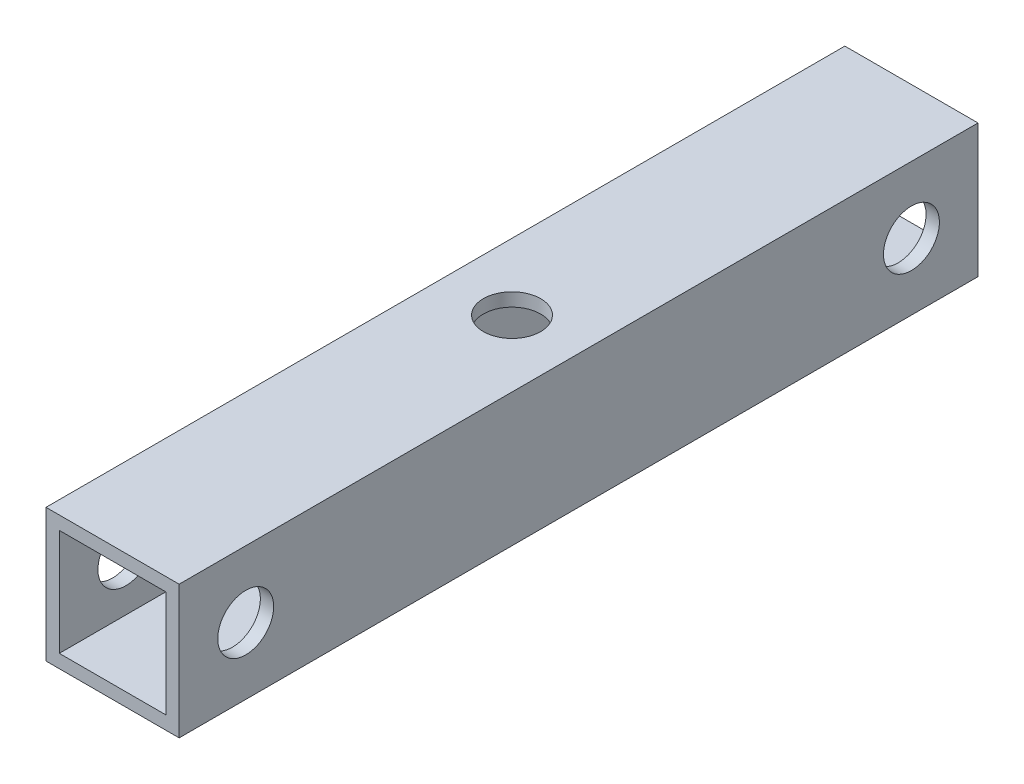
ISO-10303-21;
HEADER;
FILE_DESCRIPTION(('STEP AP214'),'2;1');
FILE_NAME('part.step','',(''),(''),'','','');
FILE_SCHEMA(('AUTOMOTIVE_DESIGN { 1 0 10303 214 1 1 1 1 }'));
ENDSEC;
DATA;
#1=APPLICATION_CONTEXT('core data for automotive mechanical design processes');
#2=APPLICATION_PROTOCOL_DEFINITION('international standard','automotive_design',2000,#1);
#3=PRODUCT_CONTEXT('',#1,'mechanical');
#4=PRODUCT('Part','Part','',(#3));
#5=PRODUCT_RELATED_PRODUCT_CATEGORY('part','',(#4));
#6=PRODUCT_DEFINITION_FORMATION('','',#4);
#7=PRODUCT_DEFINITION_CONTEXT('part definition',#1,'design');
#8=PRODUCT_DEFINITION('design','',#6,#7);
#9=PRODUCT_DEFINITION_SHAPE('','',#8);
#10=(LENGTH_UNIT() NAMED_UNIT(*) SI_UNIT(.MILLI.,.METRE.));
#11=(NAMED_UNIT(*) PLANE_ANGLE_UNIT() SI_UNIT($,.RADIAN.));
#12=(NAMED_UNIT(*) SI_UNIT($,.STERADIAN.) SOLID_ANGLE_UNIT());
#13=UNCERTAINTY_MEASURE_WITH_UNIT(LENGTH_MEASURE(1.E-05),#10,'distance_accuracy_value','');
#14=(GEOMETRIC_REPRESENTATION_CONTEXT(3) GLOBAL_UNCERTAINTY_ASSIGNED_CONTEXT((#13)) GLOBAL_UNIT_ASSIGNED_CONTEXT((#10,
#11,#12)) REPRESENTATION_CONTEXT('',''));
#15=CARTESIAN_POINT('',(0.,0.,0.));
#16=DIRECTION('',(0.,0.,1.));
#17=DIRECTION('',(1.,0.,0.));
#18=AXIS2_PLACEMENT_3D('',#15,#16,#17);
#19=CARTESIAN_POINT('',(0.,0.,60.));
#20=DIRECTION('',(0.,0.,1.));
#21=DIRECTION('',(1.,0.,0.));
#22=AXIS2_PLACEMENT_3D('',#19,#20,#21);
#23=PLANE('',#22);
#24=DIRECTION('',(0.,-1.,0.));
#25=VECTOR('',#24,1.);
#26=CARTESIAN_POINT('',(0.,0.,60.));
#27=LINE('',#26,#25);
#28=CARTESIAN_POINT('',(0.,10.,60.));
#29=VERTEX_POINT('',#28);
#30=CARTESIAN_POINT('',(0.,0.,60.));
#31=VERTEX_POINT('',#30);
#32=EDGE_CURVE('E164',#29,#31,#27,.T.);
#33=ORIENTED_EDGE('',*,*,#32,.T.);
#34=DIRECTION('',(1.,0.,0.));
#35=VECTOR('',#34,1.);
#36=CARTESIAN_POINT('',(0.,0.,60.));
#37=LINE('',#36,#35);
#38=CARTESIAN_POINT('',(10.,0.,60.));
#39=VERTEX_POINT('',#38);
#40=EDGE_CURVE('E167',#31,#39,#37,.T.);
#41=ORIENTED_EDGE('',*,*,#40,.T.);
#42=DIRECTION('',(0.,1.,0.));
#43=VECTOR('',#42,1.);
#44=CARTESIAN_POINT('',(10.,0.,60.));
#45=LINE('',#44,#43);
#46=CARTESIAN_POINT('',(9.99999999999999,10.,60.));
#47=VERTEX_POINT('',#46);
#48=EDGE_CURVE('E170',#39,#47,#45,.T.);
#49=ORIENTED_EDGE('',*,*,#48,.T.);
#50=DIRECTION('',(-1.,0.,0.));
#51=VECTOR('',#50,1.);
#52=CARTESIAN_POINT('',(0.,10.,60.));
#53=LINE('',#52,#51);
#54=EDGE_CURVE('E172',#47,#29,#53,.T.);
#55=ORIENTED_EDGE('',*,*,#54,.T.);
#56=EDGE_LOOP('',(#33,#41,#49,#55));
#57=FACE_BOUND('',#56,.T.);
#58=DIRECTION('',(1.,0.,0.));
#59=VECTOR('',#58,1.);
#60=CARTESIAN_POINT('',(0.,1.,60.));
#61=LINE('',#60,#59);
#62=CARTESIAN_POINT('',(1.,1.,60.));
#63=VERTEX_POINT('',#62);
#64=CARTESIAN_POINT('',(9.,1.,60.));
#65=VERTEX_POINT('',#64);
#66=EDGE_CURVE('E134',#63,#65,#61,.T.);
#67=ORIENTED_EDGE('',*,*,#66,.F.);
#68=DIRECTION('',(0.,-1.,0.));
#69=VECTOR('',#68,1.);
#70=CARTESIAN_POINT('',(1.,0.,60.));
#71=LINE('',#70,#69);
#72=CARTESIAN_POINT('',(0.999999999999997,9.,60.));
#73=VERTEX_POINT('',#72);
#74=EDGE_CURVE('E126',#73,#63,#71,.T.);
#75=ORIENTED_EDGE('',*,*,#74,.F.);
#76=DIRECTION('',(-1.,0.,0.));
#77=VECTOR('',#76,1.);
#78=CARTESIAN_POINT('',(0.,9.,60.));
#79=LINE('',#78,#77);
#80=CARTESIAN_POINT('',(8.99999999999999,9.,60.));
#81=VERTEX_POINT('',#80);
#82=EDGE_CURVE('E148',#81,#73,#79,.T.);
#83=ORIENTED_EDGE('',*,*,#82,.F.);
#84=DIRECTION('',(0.,1.,0.));
#85=VECTOR('',#84,1.);
#86=CARTESIAN_POINT('',(9.,0.,60.));
#87=LINE('',#86,#85);
#88=EDGE_CURVE('E146',#65,#81,#87,.T.);
#89=ORIENTED_EDGE('',*,*,#88,.F.);
#90=EDGE_LOOP('',(#67,#75,#83,#89));
#91=FACE_BOUND('',#90,.T.);
#92=ADVANCED_FACE('F59',(#57,#91),#23,.T.);
#93=CARTESIAN_POINT('',(0.,0.,0.));
#94=DIRECTION('',(0.,0.,1.));
#95=DIRECTION('',(1.,0.,0.));
#96=AXIS2_PLACEMENT_3D('',#93,#94,#95);
#97=PLANE('',#96);
#98=DIRECTION('',(0.,-1.,0.));
#99=VECTOR('',#98,1.);
#100=CARTESIAN_POINT('',(0.,0.,0.));
#101=LINE('',#100,#99);
#102=CARTESIAN_POINT('',(0.,10.,0.));
#103=VERTEX_POINT('',#102);
#104=CARTESIAN_POINT('',(0.,0.,0.));
#105=VERTEX_POINT('',#104);
#106=EDGE_CURVE('E142',#103,#105,#101,.T.);
#107=ORIENTED_EDGE('',*,*,#106,.F.);
#108=DIRECTION('',(-1.,0.,0.));
#109=VECTOR('',#108,1.);
#110=CARTESIAN_POINT('',(0.,10.,0.));
#111=LINE('',#110,#109);
#112=CARTESIAN_POINT('',(9.99999999999999,10.,0.));
#113=VERTEX_POINT('',#112);
#114=EDGE_CURVE('E168',#113,#103,#111,.T.);
#115=ORIENTED_EDGE('',*,*,#114,.F.);
#116=DIRECTION('',(0.,1.,0.));
#117=VECTOR('',#116,1.);
#118=CARTESIAN_POINT('',(10.,0.,0.));
#119=LINE('',#118,#117);
#120=CARTESIAN_POINT('',(10.,0.,0.));
#121=VERTEX_POINT('',#120);
#122=EDGE_CURVE('E179',#121,#113,#119,.T.);
#123=ORIENTED_EDGE('',*,*,#122,.F.);
#124=DIRECTION('',(1.,0.,0.));
#125=VECTOR('',#124,1.);
#126=CARTESIAN_POINT('',(0.,0.,0.));
#127=LINE('',#126,#125);
#128=EDGE_CURVE('E177',#105,#121,#127,.T.);
#129=ORIENTED_EDGE('',*,*,#128,.F.);
#130=EDGE_LOOP('',(#107,#115,#123,#129));
#131=FACE_BOUND('',#130,.T.);
#132=DIRECTION('',(0.,-1.,0.));
#133=VECTOR('',#132,1.);
#134=CARTESIAN_POINT('',(1.,0.,0.));
#135=LINE('',#134,#133);
#136=CARTESIAN_POINT('',(0.999999999999997,9.,0.));
#137=VERTEX_POINT('',#136);
#138=CARTESIAN_POINT('',(1.,1.,0.));
#139=VERTEX_POINT('',#138);
#140=EDGE_CURVE('E84',#137,#139,#135,.T.);
#141=ORIENTED_EDGE('',*,*,#140,.T.);
#142=DIRECTION('',(1.,0.,0.));
#143=VECTOR('',#142,1.);
#144=CARTESIAN_POINT('',(0.,1.,0.));
#145=LINE('',#144,#143);
#146=CARTESIAN_POINT('',(9.,1.,0.));
#147=VERTEX_POINT('',#146);
#148=EDGE_CURVE('E141',#139,#147,#145,.T.);
#149=ORIENTED_EDGE('',*,*,#148,.T.);
#150=DIRECTION('',(0.,1.,0.));
#151=VECTOR('',#150,1.);
#152=CARTESIAN_POINT('',(9.,0.,0.));
#153=LINE('',#152,#151);
#154=CARTESIAN_POINT('',(8.99999999999999,9.,0.));
#155=VERTEX_POINT('',#154);
#156=EDGE_CURVE('E156',#147,#155,#153,.T.);
#157=ORIENTED_EDGE('',*,*,#156,.T.);
#158=DIRECTION('',(-1.,0.,0.));
#159=VECTOR('',#158,1.);
#160=CARTESIAN_POINT('',(0.,9.,0.));
#161=LINE('',#160,#159);
#162=EDGE_CURVE('E135',#155,#137,#161,.T.);
#163=ORIENTED_EDGE('',*,*,#162,.T.);
#164=EDGE_LOOP('',(#141,#149,#157,#163));
#165=FACE_BOUND('',#164,.T.);
#166=ADVANCED_FACE('F241',(#131,#165),#97,.F.);
#167=CARTESIAN_POINT('',(0.,0.,60.));
#168=DIRECTION('',(1.,0.,0.));
#169=DIRECTION('',(0.,1.,0.));
#170=AXIS2_PLACEMENT_3D('',#167,#168,#169);
#171=PLANE('',#170);
#172=CARTESIAN_POINT('',(0.,5.,55.));
#173=DIRECTION('',(1.,0.,0.));
#174=DIRECTION('',(0.,1.,0.));
#175=AXIS2_PLACEMENT_3D('',#172,#173,#174);
#176=CIRCLE('',#175,2.1);
#177=CARTESIAN_POINT('',(0.,7.09999999999999,55.));
#178=VERTEX_POINT('',#177);
#179=EDGE_CURVE('E192',#178,#178,#176,.F.);
#180=ORIENTED_EDGE('',*,*,#179,.F.);
#181=EDGE_LOOP('',(#180));
#182=FACE_BOUND('',#181,.T.);
#183=CARTESIAN_POINT('',(0.,5.,5.));
#184=DIRECTION('',(1.,0.,0.));
#185=DIRECTION('',(0.,1.,0.));
#186=AXIS2_PLACEMENT_3D('',#183,#184,#185);
#187=CIRCLE('',#186,2.1);
#188=CARTESIAN_POINT('',(0.,7.09999999999999,5.));
#189=VERTEX_POINT('',#188);
#190=EDGE_CURVE('E203',#189,#189,#187,.F.);
#191=ORIENTED_EDGE('',*,*,#190,.F.);
#192=EDGE_LOOP('',(#191));
#193=FACE_BOUND('',#192,.T.);
#194=ORIENTED_EDGE('',*,*,#106,.T.);
#195=DIRECTION('',(0.,0.,-1.));
#196=VECTOR('',#195,1.);
#197=CARTESIAN_POINT('',(0.,0.,60.));
#198=LINE('',#197,#196);
#199=EDGE_CURVE('E12',#31,#105,#198,.T.);
#200=ORIENTED_EDGE('',*,*,#199,.F.);
#201=ORIENTED_EDGE('',*,*,#32,.F.);
#202=DIRECTION('',(0.,0.,-1.));
#203=VECTOR('',#202,1.);
#204=CARTESIAN_POINT('',(0.,10.,60.));
#205=LINE('',#204,#203);
#206=EDGE_CURVE('E174',#29,#103,#205,.T.);
#207=ORIENTED_EDGE('',*,*,#206,.T.);
#208=EDGE_LOOP('',(#194,#200,#201,#207));
#209=FACE_BOUND('',#208,.T.);
#210=ADVANCED_FACE('F61',(#182,#193,#209),#171,.F.);
#211=CARTESIAN_POINT('',(0.,0.,60.));
#212=DIRECTION('',(0.,1.,0.));
#213=DIRECTION('',(0.,0.,1.));
#214=AXIS2_PLACEMENT_3D('',#211,#212,#213);
#215=PLANE('',#214);
#216=CARTESIAN_POINT('',(5.,0.,30.));
#217=DIRECTION('',(0.,1.,0.));
#218=DIRECTION('',(0.,0.,1.));
#219=AXIS2_PLACEMENT_3D('',#216,#217,#218);
#220=CIRCLE('',#219,2.15);
#221=CARTESIAN_POINT('',(5.,0.,32.15));
#222=VERTEX_POINT('',#221);
#223=EDGE_CURVE('E217',#222,#222,#220,.F.);
#224=ORIENTED_EDGE('',*,*,#223,.F.);
#225=EDGE_LOOP('',(#224));
#226=FACE_BOUND('',#225,.T.);
#227=ORIENTED_EDGE('',*,*,#128,.T.);
#228=DIRECTION('',(0.,0.,-1.));
#229=VECTOR('',#228,1.);
#230=CARTESIAN_POINT('',(10.,0.,60.));
#231=LINE('',#230,#229);
#232=EDGE_CURVE('E68',#39,#121,#231,.T.);
#233=ORIENTED_EDGE('',*,*,#232,.F.);
#234=ORIENTED_EDGE('',*,*,#40,.F.);
#235=ORIENTED_EDGE('',*,*,#199,.T.);
#236=EDGE_LOOP('',(#227,#233,#234,#235));
#237=FACE_BOUND('',#236,.T.);
#238=ADVANCED_FACE('F245',(#226,#237),#215,.F.);
#239=CARTESIAN_POINT('',(10.,0.,60.));
#240=DIRECTION('',(-1.,0.,0.));
#241=DIRECTION('',(0.,-1.,0.));
#242=AXIS2_PLACEMENT_3D('',#239,#240,#241);
#243=PLANE('',#242);
#244=CARTESIAN_POINT('',(10.,5.,55.));
#245=DIRECTION('',(1.,0.,0.));
#246=DIRECTION('',(0.,1.,0.));
#247=AXIS2_PLACEMENT_3D('',#244,#245,#246);
#248=CIRCLE('',#247,2.1);
#249=CARTESIAN_POINT('',(10.,7.1,55.));
#250=VERTEX_POINT('',#249);
#251=EDGE_CURVE('E206',#250,#250,#248,.T.);
#252=ORIENTED_EDGE('',*,*,#251,.F.);
#253=EDGE_LOOP('',(#252));
#254=FACE_BOUND('',#253,.T.);
#255=CARTESIAN_POINT('',(10.,5.,5.));
#256=DIRECTION('',(1.,0.,0.));
#257=DIRECTION('',(0.,-1.,0.));
#258=AXIS2_PLACEMENT_3D('',#255,#256,#257);
#259=CIRCLE('',#258,2.1);
#260=CARTESIAN_POINT('',(10.,2.9,5.));
#261=VERTEX_POINT('',#260);
#262=EDGE_CURVE('E207',#261,#261,#259,.T.);
#263=ORIENTED_EDGE('',*,*,#262,.F.);
#264=EDGE_LOOP('',(#263));
#265=FACE_BOUND('',#264,.T.);
#266=ORIENTED_EDGE('',*,*,#122,.T.);
#267=DIRECTION('',(0.,0.,-1.));
#268=VECTOR('',#267,1.);
#269=CARTESIAN_POINT('',(9.99999999999999,10.,60.));
#270=LINE('',#269,#268);
#271=EDGE_CURVE('E184',#47,#113,#270,.T.);
#272=ORIENTED_EDGE('',*,*,#271,.F.);
#273=ORIENTED_EDGE('',*,*,#48,.F.);
#274=ORIENTED_EDGE('',*,*,#232,.T.);
#275=EDGE_LOOP('',(#266,#272,#273,#274));
#276=FACE_BOUND('',#275,.T.);
#277=ADVANCED_FACE('F229',(#254,#265,#276),#243,.F.);
#278=CARTESIAN_POINT('',(0.,10.,60.));
#279=DIRECTION('',(0.,-1.,0.));
#280=DIRECTION('',(0.,0.,-1.));
#281=AXIS2_PLACEMENT_3D('',#278,#279,#280);
#282=PLANE('',#281);
#283=CARTESIAN_POINT('',(5.,10.,30.));
#284=DIRECTION('',(0.,1.,0.));
#285=DIRECTION('',(0.,0.,1.));
#286=AXIS2_PLACEMENT_3D('',#283,#284,#285);
#287=CIRCLE('',#286,2.15);
#288=CARTESIAN_POINT('',(5.,10.,32.15));
#289=VERTEX_POINT('',#288);
#290=EDGE_CURVE('E220',#289,#289,#287,.T.);
#291=ORIENTED_EDGE('',*,*,#290,.F.);
#292=EDGE_LOOP('',(#291));
#293=FACE_BOUND('',#292,.T.);
#294=ORIENTED_EDGE('',*,*,#114,.T.);
#295=ORIENTED_EDGE('',*,*,#206,.F.);
#296=ORIENTED_EDGE('',*,*,#54,.F.);
#297=ORIENTED_EDGE('',*,*,#271,.T.);
#298=EDGE_LOOP('',(#294,#295,#296,#297));
#299=FACE_BOUND('',#298,.T.);
#300=ADVANCED_FACE('F226',(#293,#299),#282,.F.);
#301=CARTESIAN_POINT('',(1.,0.,60.));
#302=DIRECTION('',(1.,0.,0.));
#303=DIRECTION('',(0.,1.,0.));
#304=AXIS2_PLACEMENT_3D('',#301,#302,#303);
#305=PLANE('',#304);
#306=CARTESIAN_POINT('',(0.999999999999998,5.,55.));
#307=DIRECTION('',(1.,0.,0.));
#308=DIRECTION('',(0.,1.,0.));
#309=AXIS2_PLACEMENT_3D('',#306,#307,#308);
#310=CIRCLE('',#309,2.1);
#311=CARTESIAN_POINT('',(0.999999999999998,7.09999999999999,55.));
#312=VERTEX_POINT('',#311);
#313=EDGE_CURVE('E154',#312,#312,#310,.T.);
#314=ORIENTED_EDGE('',*,*,#313,.F.);
#315=EDGE_LOOP('',(#314));
#316=FACE_BOUND('',#315,.T.);
#317=CARTESIAN_POINT('',(0.999999999999998,5.,5.));
#318=DIRECTION('',(1.,0.,0.));
#319=DIRECTION('',(0.,1.,0.));
#320=AXIS2_PLACEMENT_3D('',#317,#318,#319);
#321=CIRCLE('',#320,2.1);
#322=CARTESIAN_POINT('',(0.999999999999998,7.09999999999999,5.));
#323=VERTEX_POINT('',#322);
#324=EDGE_CURVE('E191',#323,#323,#321,.T.);
#325=ORIENTED_EDGE('',*,*,#324,.F.);
#326=EDGE_LOOP('',(#325));
#327=FACE_BOUND('',#326,.T.);
#328=ORIENTED_EDGE('',*,*,#140,.F.);
#329=DIRECTION('',(0.,0.,-1.));
#330=VECTOR('',#329,1.);
#331=CARTESIAN_POINT('',(0.999999999999997,9.,60.));
#332=LINE('',#331,#330);
#333=EDGE_CURVE('E130',#73,#137,#332,.T.);
#334=ORIENTED_EDGE('',*,*,#333,.F.);
#335=ORIENTED_EDGE('',*,*,#74,.T.);
#336=DIRECTION('',(0.,0.,-1.));
#337=VECTOR('',#336,1.);
#338=CARTESIAN_POINT('',(1.,1.,60.));
#339=LINE('',#338,#337);
#340=EDGE_CURVE('E129',#63,#139,#339,.T.);
#341=ORIENTED_EDGE('',*,*,#340,.T.);
#342=EDGE_LOOP('',(#328,#334,#335,#341));
#343=FACE_BOUND('',#342,.T.);
#344=ADVANCED_FACE('F128',(#316,#327,#343),#305,.T.);
#345=CARTESIAN_POINT('',(0.,1.,60.));
#346=DIRECTION('',(0.,1.,0.));
#347=DIRECTION('',(0.,0.,1.));
#348=AXIS2_PLACEMENT_3D('',#345,#346,#347);
#349=PLANE('',#348);
#350=CARTESIAN_POINT('',(5.,1.,30.));
#351=DIRECTION('',(0.,1.,0.));
#352=DIRECTION('',(0.,0.,1.));
#353=AXIS2_PLACEMENT_3D('',#350,#351,#352);
#354=CIRCLE('',#353,2.15);
#355=CARTESIAN_POINT('',(5.,1.,32.15));
#356=VERTEX_POINT('',#355);
#357=EDGE_CURVE('E210',#356,#356,#354,.T.);
#358=ORIENTED_EDGE('',*,*,#357,.F.);
#359=EDGE_LOOP('',(#358));
#360=FACE_BOUND('',#359,.T.);
#361=ORIENTED_EDGE('',*,*,#148,.F.);
#362=ORIENTED_EDGE('',*,*,#340,.F.);
#363=ORIENTED_EDGE('',*,*,#66,.T.);
#364=DIRECTION('',(0.,0.,-1.));
#365=VECTOR('',#364,1.);
#366=CARTESIAN_POINT('',(9.,1.,60.));
#367=LINE('',#366,#365);
#368=EDGE_CURVE('E143',#65,#147,#367,.T.);
#369=ORIENTED_EDGE('',*,*,#368,.T.);
#370=EDGE_LOOP('',(#361,#362,#363,#369));
#371=FACE_BOUND('',#370,.T.);
#372=ADVANCED_FACE('F138',(#360,#371),#349,.T.);
#373=CARTESIAN_POINT('',(9.,0.,60.));
#374=DIRECTION('',(-1.,0.,0.));
#375=DIRECTION('',(0.,-1.,0.));
#376=AXIS2_PLACEMENT_3D('',#373,#374,#375);
#377=PLANE('',#376);
#378=CARTESIAN_POINT('',(9.,5.,55.));
#379=DIRECTION('',(-1.,0.,0.));
#380=DIRECTION('',(0.,-1.,0.));
#381=AXIS2_PLACEMENT_3D('',#378,#379,#380);
#382=CIRCLE('',#381,2.1);
#383=CARTESIAN_POINT('',(9.,2.9,55.));
#384=VERTEX_POINT('',#383);
#385=EDGE_CURVE('E193',#384,#384,#382,.T.);
#386=ORIENTED_EDGE('',*,*,#385,.F.);
#387=EDGE_LOOP('',(#386));
#388=FACE_BOUND('',#387,.T.);
#389=CARTESIAN_POINT('',(9.,5.,5.));
#390=DIRECTION('',(-1.,0.,0.));
#391=DIRECTION('',(0.,-1.,0.));
#392=AXIS2_PLACEMENT_3D('',#389,#390,#391);
#393=CIRCLE('',#392,2.1);
#394=CARTESIAN_POINT('',(9.,2.9,5.));
#395=VERTEX_POINT('',#394);
#396=EDGE_CURVE('E189',#395,#395,#393,.T.);
#397=ORIENTED_EDGE('',*,*,#396,.F.);
#398=EDGE_LOOP('',(#397));
#399=FACE_BOUND('',#398,.T.);
#400=ORIENTED_EDGE('',*,*,#156,.F.);
#401=ORIENTED_EDGE('',*,*,#368,.F.);
#402=ORIENTED_EDGE('',*,*,#88,.T.);
#403=DIRECTION('',(0.,0.,-1.));
#404=VECTOR('',#403,1.);
#405=CARTESIAN_POINT('',(8.99999999999999,9.,60.));
#406=LINE('',#405,#404);
#407=EDGE_CURVE('E76',#81,#155,#406,.T.);
#408=ORIENTED_EDGE('',*,*,#407,.T.);
#409=EDGE_LOOP('',(#400,#401,#402,#408));
#410=FACE_BOUND('',#409,.T.);
#411=ADVANCED_FACE('F270',(#388,#399,#410),#377,.T.);
#412=CARTESIAN_POINT('',(0.,9.,60.));
#413=DIRECTION('',(0.,-1.,0.));
#414=DIRECTION('',(0.,0.,-1.));
#415=AXIS2_PLACEMENT_3D('',#412,#413,#414);
#416=PLANE('',#415);
#417=CARTESIAN_POINT('',(5.,9.,30.));
#418=DIRECTION('',(0.,-1.,0.));
#419=DIRECTION('',(0.,0.,-1.));
#420=AXIS2_PLACEMENT_3D('',#417,#418,#419);
#421=CIRCLE('',#420,2.15);
#422=CARTESIAN_POINT('',(5.,9.,27.85));
#423=VERTEX_POINT('',#422);
#424=EDGE_CURVE('E63',#423,#423,#421,.T.);
#425=ORIENTED_EDGE('',*,*,#424,.F.);
#426=EDGE_LOOP('',(#425));
#427=FACE_BOUND('',#426,.T.);
#428=ORIENTED_EDGE('',*,*,#162,.F.);
#429=ORIENTED_EDGE('',*,*,#407,.F.);
#430=ORIENTED_EDGE('',*,*,#82,.T.);
#431=ORIENTED_EDGE('',*,*,#333,.T.);
#432=EDGE_LOOP('',(#428,#429,#430,#431));
#433=FACE_BOUND('',#432,.T.);
#434=ADVANCED_FACE('F274',(#427,#433),#416,.T.);
#435=CARTESIAN_POINT('',(-5.939696961967,4.99999999999999,5.));
#436=DIRECTION('',(1.,0.,0.));
#437=DIRECTION('',(0.,1.,0.));
#438=AXIS2_PLACEMENT_3D('',#435,#436,#437);
#439=CYLINDRICAL_SURFACE('',#438,2.1);
#440=ORIENTED_EDGE('',*,*,#396,.T.);
#441=EDGE_LOOP('',(#440));
#442=FACE_BOUND('',#441,.T.);
#443=ORIENTED_EDGE('',*,*,#262,.T.);
#444=EDGE_LOOP('',(#443));
#445=FACE_BOUND('',#444,.T.);
#446=ADVANCED_FACE('F278',(#442,#445),#439,.F.);
#447=CARTESIAN_POINT('',(-5.939696961967,4.99999999999999,55.));
#448=DIRECTION('',(1.,0.,0.));
#449=DIRECTION('',(0.,1.,0.));
#450=AXIS2_PLACEMENT_3D('',#447,#448,#449);
#451=CYLINDRICAL_SURFACE('',#450,2.1);
#452=ORIENTED_EDGE('',*,*,#385,.T.);
#453=EDGE_LOOP('',(#452));
#454=FACE_BOUND('',#453,.T.);
#455=ORIENTED_EDGE('',*,*,#251,.T.);
#456=EDGE_LOOP('',(#455));
#457=FACE_BOUND('',#456,.T.);
#458=ADVANCED_FACE('F282',(#454,#457),#451,.F.);
#459=ORIENTED_EDGE('',*,*,#324,.T.);
#460=EDGE_LOOP('',(#459));
#461=FACE_BOUND('',#460,.T.);
#462=ORIENTED_EDGE('',*,*,#190,.T.);
#463=EDGE_LOOP('',(#462));
#464=FACE_BOUND('',#463,.T.);
#465=ADVANCED_FACE('F284',(#461,#464),#439,.F.);
#466=ORIENTED_EDGE('',*,*,#313,.T.);
#467=EDGE_LOOP('',(#466));
#468=FACE_BOUND('',#467,.T.);
#469=ORIENTED_EDGE('',*,*,#179,.T.);
#470=EDGE_LOOP('',(#469));
#471=FACE_BOUND('',#470,.T.);
#472=ADVANCED_FACE('F287',(#468,#471),#451,.F.);
#473=CARTESIAN_POINT('',(5.,-6.08111831820431,30.));
#474=DIRECTION('',(0.,1.,0.));
#475=DIRECTION('',(0.,0.,1.));
#476=AXIS2_PLACEMENT_3D('',#473,#474,#475);
#477=CYLINDRICAL_SURFACE('',#476,2.15);
#478=ORIENTED_EDGE('',*,*,#424,.T.);
#479=EDGE_LOOP('',(#478));
#480=FACE_BOUND('',#479,.T.);
#481=ORIENTED_EDGE('',*,*,#290,.T.);
#482=EDGE_LOOP('',(#481));
#483=FACE_BOUND('',#482,.T.);
#484=ADVANCED_FACE('F224',(#480,#483),#477,.F.);
#485=ORIENTED_EDGE('',*,*,#357,.T.);
#486=EDGE_LOOP('',(#485));
#487=FACE_BOUND('',#486,.T.);
#488=ORIENTED_EDGE('',*,*,#223,.T.);
#489=EDGE_LOOP('',(#488));
#490=FACE_BOUND('',#489,.T.);
#491=ADVANCED_FACE('F289',(#487,#490),#477,.F.);
#492=CLOSED_SHELL('',(#92,#166,#210,#238,#277,#300,#344,#372,#411,#434,#446,#458,#465,#472,#484,#491));
#493=MANIFOLD_SOLID_BREP('B2',#492);
#494=ADVANCED_BREP_SHAPE_REPRESENTATION('',(#18,#493),#14);
#495=SHAPE_DEFINITION_REPRESENTATION(#9,#494);
ENDSEC;
END-ISO-10303-21;
